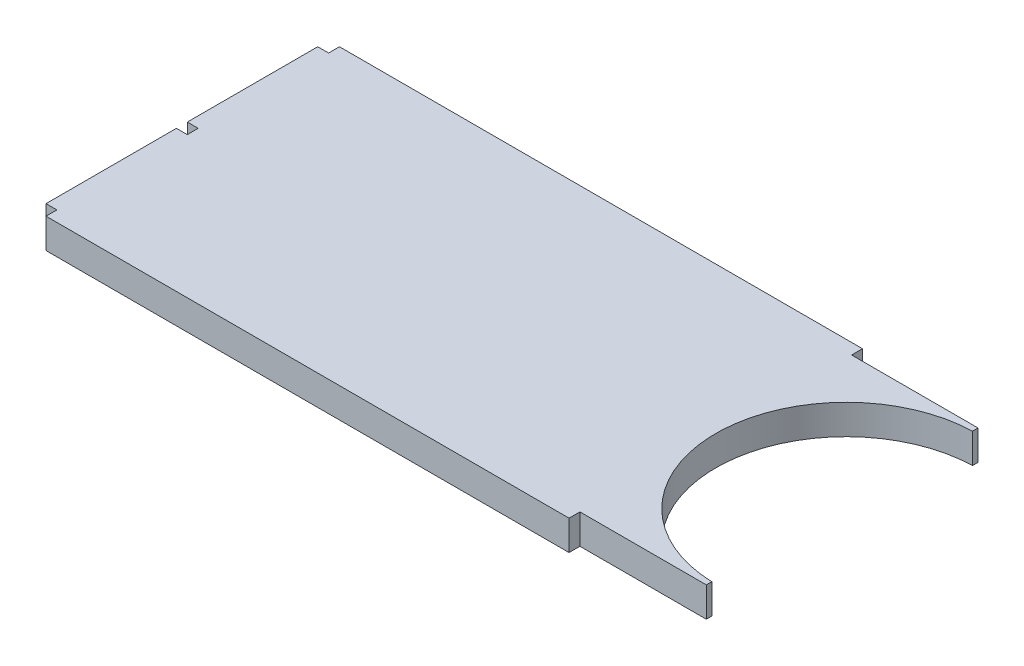
ISO-10303-21;
HEADER;
FILE_DESCRIPTION(('STEP AP214'),'2;1');
FILE_NAME('part.step','',(''),(''),'','','');
FILE_SCHEMA(('AUTOMOTIVE_DESIGN { 1 0 10303 214 1 1 1 1 }'));
ENDSEC;
DATA;
#1=APPLICATION_CONTEXT('core data for automotive mechanical design processes');
#2=APPLICATION_PROTOCOL_DEFINITION('international standard','automotive_design',2000,#1);
#3=PRODUCT_CONTEXT('',#1,'mechanical');
#4=PRODUCT('Part','Part','',(#3));
#5=PRODUCT_RELATED_PRODUCT_CATEGORY('part','',(#4));
#6=PRODUCT_DEFINITION_FORMATION('','',#4);
#7=PRODUCT_DEFINITION_CONTEXT('part definition',#1,'design');
#8=PRODUCT_DEFINITION('design','',#6,#7);
#9=PRODUCT_DEFINITION_SHAPE('','',#8);
#10=(LENGTH_UNIT() NAMED_UNIT(*) SI_UNIT(.MILLI.,.METRE.));
#11=(NAMED_UNIT(*) PLANE_ANGLE_UNIT() SI_UNIT($,.RADIAN.));
#12=(NAMED_UNIT(*) SI_UNIT($,.STERADIAN.) SOLID_ANGLE_UNIT());
#13=UNCERTAINTY_MEASURE_WITH_UNIT(LENGTH_MEASURE(1.E-05),#10,'distance_accuracy_value','');
#14=(GEOMETRIC_REPRESENTATION_CONTEXT(3) GLOBAL_UNCERTAINTY_ASSIGNED_CONTEXT((#13)) GLOBAL_UNIT_ASSIGNED_CONTEXT((#10,
#11,#12)) REPRESENTATION_CONTEXT('',''));
#15=CARTESIAN_POINT('',(0.,0.,0.));
#16=DIRECTION('',(0.,0.,1.));
#17=DIRECTION('',(1.,0.,0.));
#18=AXIS2_PLACEMENT_3D('',#15,#16,#17);
#19=CARTESIAN_POINT('',(60.75,5.4864,27.));
#20=DIRECTION('',(-1.,0.,0.));
#21=DIRECTION('',(0.,0.,1.));
#22=AXIS2_PLACEMENT_3D('',#19,#20,#21);
#23=PLANE('',#22);
#24=DIRECTION('',(0.,0.,-1.));
#25=VECTOR('',#24,1.);
#26=CARTESIAN_POINT('',(60.75,0.,27.));
#27=LINE('',#26,#25);
#28=CARTESIAN_POINT('',(60.75,0.,25.));
#29=VERTEX_POINT('',#28);
#30=CARTESIAN_POINT('',(60.75,0.,23.9884031148386));
#31=VERTEX_POINT('',#30);
#32=EDGE_CURVE('E288',#29,#31,#27,.T.);
#33=ORIENTED_EDGE('',*,*,#32,.T.);
#34=DIRECTION('',(0.,1.,0.));
#35=VECTOR('',#34,1.);
#36=CARTESIAN_POINT('',(60.75,0.,23.9884031148386));
#37=LINE('',#36,#35);
#38=CARTESIAN_POINT('',(60.75,5.4864,23.9884031148386));
#39=VERTEX_POINT('',#38);
#40=EDGE_CURVE('E218',#31,#39,#37,.T.);
#41=ORIENTED_EDGE('',*,*,#40,.T.);
#42=DIRECTION('',(0.,0.,-1.));
#43=VECTOR('',#42,1.);
#44=CARTESIAN_POINT('',(60.75,5.4864,27.));
#45=LINE('',#44,#43);
#46=CARTESIAN_POINT('',(60.75,5.4864,25.));
#47=VERTEX_POINT('',#46);
#48=EDGE_CURVE('E280',#47,#39,#45,.T.);
#49=ORIENTED_EDGE('',*,*,#48,.F.);
#50=DIRECTION('',(0.,1.,0.));
#51=VECTOR('',#50,1.);
#52=CARTESIAN_POINT('',(60.75,0.,25.));
#53=LINE('',#52,#51);
#54=EDGE_CURVE('E205',#29,#47,#53,.T.);
#55=ORIENTED_EDGE('',*,*,#54,.F.);
#56=EDGE_LOOP('',(#33,#41,#49,#55));
#57=FACE_BOUND('',#56,.T.);
#58=ADVANCED_FACE('F33',(#57),#23,.F.);
#59=CARTESIAN_POINT('',(-60.75,5.4864,27.));
#60=DIRECTION('',(1.,0.,0.));
#61=DIRECTION('',(0.,0.,-1.));
#62=AXIS2_PLACEMENT_3D('',#59,#60,#61);
#63=PLANE('',#62);
#64=DIRECTION('',(0.,0.,1.));
#65=VECTOR('',#64,1.);
#66=CARTESIAN_POINT('',(-60.75,5.4864,27.));
#67=LINE('',#66,#65);
#68=CARTESIAN_POINT('',(-60.75,5.4864,0.999999999999999));
#69=VERTEX_POINT('',#68);
#70=CARTESIAN_POINT('',(-60.75,5.4864,25.));
#71=VERTEX_POINT('',#70);
#72=EDGE_CURVE('E283',#69,#71,#67,.T.);
#73=ORIENTED_EDGE('',*,*,#72,.F.);
#74=DIRECTION('',(0.,1.,0.));
#75=VECTOR('',#74,1.);
#76=CARTESIAN_POINT('',(-60.75,0.,0.999999999999999));
#77=LINE('',#76,#75);
#78=CARTESIAN_POINT('',(-60.75,0.,0.999999999999999));
#79=VERTEX_POINT('',#78);
#80=EDGE_CURVE('E197',#79,#69,#77,.T.);
#81=ORIENTED_EDGE('',*,*,#80,.F.);
#82=DIRECTION('',(0.,0.,1.));
#83=VECTOR('',#82,1.);
#84=CARTESIAN_POINT('',(-60.75,0.,27.));
#85=LINE('',#84,#83);
#86=CARTESIAN_POINT('',(-60.75,0.,25.));
#87=VERTEX_POINT('',#86);
#88=EDGE_CURVE('E290',#79,#87,#85,.T.);
#89=ORIENTED_EDGE('',*,*,#88,.T.);
#90=DIRECTION('',(0.,1.,0.));
#91=VECTOR('',#90,1.);
#92=CARTESIAN_POINT('',(-60.75,0.,25.));
#93=LINE('',#92,#91);
#94=EDGE_CURVE('E235',#87,#71,#93,.T.);
#95=ORIENTED_EDGE('',*,*,#94,.T.);
#96=EDGE_LOOP('',(#73,#81,#89,#95));
#97=FACE_BOUND('',#96,.T.);
#98=ADVANCED_FACE('F299',(#97),#63,.F.);
#99=CARTESIAN_POINT('',(60.75,5.4864,-23.9884031148386));
#100=VERTEX_POINT('',#99);
#101=CARTESIAN_POINT('',(60.75,5.4864,-25.));
#102=VERTEX_POINT('',#101);
#103=EDGE_CURVE('E277',#100,#102,#45,.T.);
#104=ORIENTED_EDGE('',*,*,#103,.F.);
#105=DIRECTION('',(0.,1.,0.));
#106=VECTOR('',#105,1.);
#107=CARTESIAN_POINT('',(60.75,0.,-23.9884031148386));
#108=LINE('',#107,#106);
#109=CARTESIAN_POINT('',(60.75,0.,-23.9884031148386));
#110=VERTEX_POINT('',#109);
#111=EDGE_CURVE('E209',#110,#100,#108,.T.);
#112=ORIENTED_EDGE('',*,*,#111,.F.);
#113=CARTESIAN_POINT('',(60.75,0.,-25.));
#114=VERTEX_POINT('',#113);
#115=EDGE_CURVE('E273',#110,#114,#27,.T.);
#116=ORIENTED_EDGE('',*,*,#115,.T.);
#117=DIRECTION('',(0.,1.,0.));
#118=VECTOR('',#117,1.);
#119=CARTESIAN_POINT('',(60.75,0.,-25.));
#120=LINE('',#119,#118);
#121=EDGE_CURVE('E254',#114,#102,#120,.T.);
#122=ORIENTED_EDGE('',*,*,#121,.T.);
#123=EDGE_LOOP('',(#104,#112,#116,#122));
#124=FACE_BOUND('',#123,.T.);
#125=ADVANCED_FACE('F35',(#124),#23,.F.);
#126=CARTESIAN_POINT('',(-60.75,5.4864,-27.));
#127=DIRECTION('',(0.,0.,1.));
#128=DIRECTION('',(1.,0.,0.));
#129=AXIS2_PLACEMENT_3D('',#126,#127,#128);
#130=PLANE('',#129);
#131=DIRECTION('',(-1.,0.,0.));
#132=VECTOR('',#131,1.);
#133=CARTESIAN_POINT('',(-60.75,5.4864,-27.));
#134=LINE('',#133,#132);
#135=CARTESIAN_POINT('',(37.496,5.4864,-27.));
#136=VERTEX_POINT('',#135);
#137=CARTESIAN_POINT('',(-58.75,5.4864,-27.));
#138=VERTEX_POINT('',#137);
#139=EDGE_CURVE('E281',#136,#138,#134,.T.);
#140=ORIENTED_EDGE('',*,*,#139,.F.);
#141=DIRECTION('',(0.,1.,0.));
#142=VECTOR('',#141,1.);
#143=CARTESIAN_POINT('',(37.496,0.,-27.));
#144=LINE('',#143,#142);
#145=CARTESIAN_POINT('',(37.496,0.,-27.));
#146=VERTEX_POINT('',#145);
#147=EDGE_CURVE('E233',#146,#136,#144,.T.);
#148=ORIENTED_EDGE('',*,*,#147,.F.);
#149=DIRECTION('',(-1.,0.,0.));
#150=VECTOR('',#149,1.);
#151=CARTESIAN_POINT('',(-60.75,0.,-27.));
#152=LINE('',#151,#150);
#153=CARTESIAN_POINT('',(-58.75,0.,-27.));
#154=VERTEX_POINT('',#153);
#155=EDGE_CURVE('E289',#146,#154,#152,.T.);
#156=ORIENTED_EDGE('',*,*,#155,.T.);
#157=DIRECTION('',(0.,1.,0.));
#158=VECTOR('',#157,1.);
#159=CARTESIAN_POINT('',(-58.75,0.,-27.));
#160=LINE('',#159,#158);
#161=EDGE_CURVE('E270',#154,#138,#160,.T.);
#162=ORIENTED_EDGE('',*,*,#161,.T.);
#163=EDGE_LOOP('',(#140,#148,#156,#162));
#164=FACE_BOUND('',#163,.T.);
#165=ADVANCED_FACE('F339',(#164),#130,.F.);
#166=CARTESIAN_POINT('',(-60.75,0.,-25.));
#167=VERTEX_POINT('',#166);
#168=CARTESIAN_POINT('',(-60.75,0.,-0.999999999999997));
#169=VERTEX_POINT('',#168);
#170=EDGE_CURVE('E291',#167,#169,#85,.T.);
#171=ORIENTED_EDGE('',*,*,#170,.T.);
#172=DIRECTION('',(0.,1.,0.));
#173=VECTOR('',#172,1.);
#174=CARTESIAN_POINT('',(-60.75,0.,-0.999999999999998));
#175=LINE('',#174,#173);
#176=CARTESIAN_POINT('',(-60.75,5.4864,-0.999999999999998));
#177=VERTEX_POINT('',#176);
#178=EDGE_CURVE('E170',#169,#177,#175,.T.);
#179=ORIENTED_EDGE('',*,*,#178,.T.);
#180=CARTESIAN_POINT('',(-60.75,5.4864,-25.));
#181=VERTEX_POINT('',#180);
#182=EDGE_CURVE('E42',#181,#177,#67,.T.);
#183=ORIENTED_EDGE('',*,*,#182,.F.);
#184=DIRECTION('',(0.,1.,0.));
#185=VECTOR('',#184,1.);
#186=CARTESIAN_POINT('',(-60.75,0.,-25.));
#187=LINE('',#186,#185);
#188=EDGE_CURVE('E265',#167,#181,#187,.T.);
#189=ORIENTED_EDGE('',*,*,#188,.F.);
#190=EDGE_LOOP('',(#171,#179,#183,#189));
#191=FACE_BOUND('',#190,.T.);
#192=ADVANCED_FACE('F336',(#191),#63,.F.);
#193=CARTESIAN_POINT('',(-60.75,5.4864,27.));
#194=DIRECTION('',(0.,0.,-1.));
#195=DIRECTION('',(-1.,0.,0.));
#196=AXIS2_PLACEMENT_3D('',#193,#194,#195);
#197=PLANE('',#196);
#198=DIRECTION('',(1.,0.,0.));
#199=VECTOR('',#198,1.);
#200=CARTESIAN_POINT('',(-60.75,0.,27.));
#201=LINE('',#200,#199);
#202=CARTESIAN_POINT('',(-58.75,0.,27.));
#203=VERTEX_POINT('',#202);
#204=CARTESIAN_POINT('',(37.496,0.,27.));
#205=VERTEX_POINT('',#204);
#206=EDGE_CURVE('E37',#203,#205,#201,.T.);
#207=ORIENTED_EDGE('',*,*,#206,.T.);
#208=DIRECTION('',(0.,1.,0.));
#209=VECTOR('',#208,1.);
#210=CARTESIAN_POINT('',(37.496,0.,27.));
#211=LINE('',#210,#209);
#212=CARTESIAN_POINT('',(37.496,5.4864,27.));
#213=VERTEX_POINT('',#212);
#214=EDGE_CURVE('E192',#205,#213,#211,.T.);
#215=ORIENTED_EDGE('',*,*,#214,.T.);
#216=DIRECTION('',(1.,0.,0.));
#217=VECTOR('',#216,1.);
#218=CARTESIAN_POINT('',(-60.75,5.4864,27.));
#219=LINE('',#218,#217);
#220=CARTESIAN_POINT('',(-58.75,5.4864,27.));
#221=VERTEX_POINT('',#220);
#222=EDGE_CURVE('E11',#221,#213,#219,.T.);
#223=ORIENTED_EDGE('',*,*,#222,.F.);
#224=DIRECTION('',(0.,1.,0.));
#225=VECTOR('',#224,1.);
#226=CARTESIAN_POINT('',(-58.75,0.,27.));
#227=LINE('',#226,#225);
#228=EDGE_CURVE('E229',#203,#221,#227,.T.);
#229=ORIENTED_EDGE('',*,*,#228,.F.);
#230=EDGE_LOOP('',(#207,#215,#223,#229));
#231=FACE_BOUND('',#230,.T.);
#232=ADVANCED_FACE('F308',(#231),#197,.F.);
#233=CARTESIAN_POINT('',(0.,5.4864,0.));
#234=DIRECTION('',(0.,-1.,0.));
#235=DIRECTION('',(0.,0.,-1.));
#236=AXIS2_PLACEMENT_3D('',#233,#234,#235);
#237=PLANE('',#236);
#238=ORIENTED_EDGE('',*,*,#48,.T.);
#239=CARTESIAN_POINT('',(61.496,5.4864,0.));
#240=DIRECTION('',(0.,1.,0.));
#241=DIRECTION('',(0.,0.,-1.));
#242=AXIS2_PLACEMENT_3D('',#239,#240,#241);
#243=CIRCLE('',#242,24.);
#244=EDGE_CURVE('E219',#100,#39,#243,.T.);
#245=ORIENTED_EDGE('',*,*,#244,.F.);
#246=ORIENTED_EDGE('',*,*,#103,.T.);
#247=DIRECTION('',(1.,0.,0.));
#248=VECTOR('',#247,1.);
#249=CARTESIAN_POINT('',(37.496,5.4864,-25.));
#250=LINE('',#249,#248);
#251=CARTESIAN_POINT('',(37.496,5.4864,-25.));
#252=VERTEX_POINT('',#251);
#253=EDGE_CURVE('E246',#252,#102,#250,.T.);
#254=ORIENTED_EDGE('',*,*,#253,.F.);
#255=DIRECTION('',(0.,0.,1.));
#256=VECTOR('',#255,1.);
#257=CARTESIAN_POINT('',(37.496,5.4864,-27.));
#258=LINE('',#257,#256);
#259=EDGE_CURVE('E196',#136,#252,#258,.T.);
#260=ORIENTED_EDGE('',*,*,#259,.F.);
#261=ORIENTED_EDGE('',*,*,#139,.T.);
#262=DIRECTION('',(0.,0.,-1.));
#263=VECTOR('',#262,1.);
#264=CARTESIAN_POINT('',(-58.75,5.4864,-27.));
#265=LINE('',#264,#263);
#266=CARTESIAN_POINT('',(-58.75,5.4864,-25.));
#267=VERTEX_POINT('',#266);
#268=EDGE_CURVE('E262',#267,#138,#265,.T.);
#269=ORIENTED_EDGE('',*,*,#268,.F.);
#270=DIRECTION('',(1.,0.,0.));
#271=VECTOR('',#270,1.);
#272=CARTESIAN_POINT('',(-60.75,5.4864,-25.));
#273=LINE('',#272,#271);
#274=EDGE_CURVE('E238',#181,#267,#273,.T.);
#275=ORIENTED_EDGE('',*,*,#274,.F.);
#276=ORIENTED_EDGE('',*,*,#182,.T.);
#277=DIRECTION('',(-1.,0.,0.));
#278=VECTOR('',#277,1.);
#279=CARTESIAN_POINT('',(-58.75,5.4864,-0.999999999999999));
#280=LINE('',#279,#278);
#281=CARTESIAN_POINT('',(-58.75,5.4864,-0.999999999999999));
#282=VERTEX_POINT('',#281);
#283=EDGE_CURVE('E187',#282,#177,#280,.T.);
#284=ORIENTED_EDGE('',*,*,#283,.F.);
#285=DIRECTION('',(0.,0.,-1.));
#286=VECTOR('',#285,1.);
#287=CARTESIAN_POINT('',(-58.75,5.4864,0.999999999999999));
#288=LINE('',#287,#286);
#289=CARTESIAN_POINT('',(-58.75,5.4864,0.999999999999999));
#290=VERTEX_POINT('',#289);
#291=EDGE_CURVE('E167',#290,#282,#288,.T.);
#292=ORIENTED_EDGE('',*,*,#291,.F.);
#293=DIRECTION('',(1.,0.,0.));
#294=VECTOR('',#293,1.);
#295=CARTESIAN_POINT('',(-58.75,5.4864,0.999999999999999));
#296=LINE('',#295,#294);
#297=EDGE_CURVE('E184',#69,#290,#296,.T.);
#298=ORIENTED_EDGE('',*,*,#297,.F.);
#299=ORIENTED_EDGE('',*,*,#72,.T.);
#300=DIRECTION('',(-1.,0.,0.));
#301=VECTOR('',#300,1.);
#302=CARTESIAN_POINT('',(-60.75,5.4864,25.));
#303=LINE('',#302,#301);
#304=CARTESIAN_POINT('',(-58.75,5.4864,25.));
#305=VERTEX_POINT('',#304);
#306=EDGE_CURVE('E227',#305,#71,#303,.T.);
#307=ORIENTED_EDGE('',*,*,#306,.F.);
#308=DIRECTION('',(0.,0.,-1.));
#309=VECTOR('',#308,1.);
#310=CARTESIAN_POINT('',(-58.75,5.4864,27.));
#311=LINE('',#310,#309);
#312=EDGE_CURVE('E230',#221,#305,#311,.T.);
#313=ORIENTED_EDGE('',*,*,#312,.F.);
#314=ORIENTED_EDGE('',*,*,#222,.T.);
#315=DIRECTION('',(0.,0.,1.));
#316=VECTOR('',#315,1.);
#317=CARTESIAN_POINT('',(37.496,5.4864,25.));
#318=LINE('',#317,#316);
#319=CARTESIAN_POINT('',(37.496,5.4864,25.));
#320=VERTEX_POINT('',#319);
#321=EDGE_CURVE('E203',#320,#213,#318,.T.);
#322=ORIENTED_EDGE('',*,*,#321,.F.);
#323=DIRECTION('',(-1.,0.,0.));
#324=VECTOR('',#323,1.);
#325=CARTESIAN_POINT('',(60.75,5.4864,25.));
#326=LINE('',#325,#324);
#327=EDGE_CURVE('E206',#47,#320,#326,.T.);
#328=ORIENTED_EDGE('',*,*,#327,.F.);
#329=EDGE_LOOP('',(#238,#245,#246,#254,#260,#261,#269,#275,#276,#284,#292,#298,#299,#307,#313,
#314,#322,#328));
#330=FACE_BOUND('',#329,.T.);
#331=ADVANCED_FACE('F312',(#330),#237,.F.);
#332=CARTESIAN_POINT('',(0.,0.,0.));
#333=DIRECTION('',(0.,-1.,0.));
#334=DIRECTION('',(0.,0.,-1.));
#335=AXIS2_PLACEMENT_3D('',#332,#333,#334);
#336=PLANE('',#335);
#337=CARTESIAN_POINT('',(61.496,0.,0.));
#338=DIRECTION('',(0.,1.,0.));
#339=DIRECTION('',(0.,0.,-1.));
#340=AXIS2_PLACEMENT_3D('',#337,#338,#339);
#341=CIRCLE('',#340,24.);
#342=EDGE_CURVE('E216',#110,#31,#341,.T.);
#343=ORIENTED_EDGE('',*,*,#342,.T.);
#344=ORIENTED_EDGE('',*,*,#32,.F.);
#345=DIRECTION('',(-1.,0.,0.));
#346=VECTOR('',#345,1.);
#347=CARTESIAN_POINT('',(60.75,0.,25.));
#348=LINE('',#347,#346);
#349=CARTESIAN_POINT('',(37.496,0.,25.));
#350=VERTEX_POINT('',#349);
#351=EDGE_CURVE('E200',#29,#350,#348,.T.);
#352=ORIENTED_EDGE('',*,*,#351,.T.);
#353=DIRECTION('',(0.,0.,1.));
#354=VECTOR('',#353,1.);
#355=CARTESIAN_POINT('',(37.496,0.,25.));
#356=LINE('',#355,#354);
#357=EDGE_CURVE('E50',#350,#205,#356,.T.);
#358=ORIENTED_EDGE('',*,*,#357,.T.);
#359=ORIENTED_EDGE('',*,*,#206,.F.);
#360=DIRECTION('',(0.,0.,-1.));
#361=VECTOR('',#360,1.);
#362=CARTESIAN_POINT('',(-58.75,0.,27.));
#363=LINE('',#362,#361);
#364=CARTESIAN_POINT('',(-58.75,0.,25.));
#365=VERTEX_POINT('',#364);
#366=EDGE_CURVE('E224',#203,#365,#363,.T.);
#367=ORIENTED_EDGE('',*,*,#366,.T.);
#368=DIRECTION('',(-1.,0.,0.));
#369=VECTOR('',#368,1.);
#370=CARTESIAN_POINT('',(-60.75,0.,25.));
#371=LINE('',#370,#369);
#372=EDGE_CURVE('E58',#365,#87,#371,.T.);
#373=ORIENTED_EDGE('',*,*,#372,.T.);
#374=ORIENTED_EDGE('',*,*,#88,.F.);
#375=DIRECTION('',(1.,0.,0.));
#376=VECTOR('',#375,1.);
#377=CARTESIAN_POINT('',(-58.75,0.,0.999999999999999));
#378=LINE('',#377,#376);
#379=CARTESIAN_POINT('',(-58.75,0.,0.999999999999999));
#380=VERTEX_POINT('',#379);
#381=EDGE_CURVE('E171',#79,#380,#378,.T.);
#382=ORIENTED_EDGE('',*,*,#381,.T.);
#383=DIRECTION('',(0.,0.,-1.));
#384=VECTOR('',#383,1.);
#385=CARTESIAN_POINT('',(-58.75,0.,0.999999999999999));
#386=LINE('',#385,#384);
#387=CARTESIAN_POINT('',(-58.75,0.,-0.999999999999999));
#388=VERTEX_POINT('',#387);
#389=EDGE_CURVE('E164',#380,#388,#386,.T.);
#390=ORIENTED_EDGE('',*,*,#389,.T.);
#391=DIRECTION('',(-1.,0.,0.));
#392=VECTOR('',#391,1.);
#393=CARTESIAN_POINT('',(-58.75,0.,-0.999999999999999));
#394=LINE('',#393,#392);
#395=EDGE_CURVE('E174',#388,#169,#394,.T.);
#396=ORIENTED_EDGE('',*,*,#395,.T.);
#397=ORIENTED_EDGE('',*,*,#170,.F.);
#398=DIRECTION('',(1.,0.,0.));
#399=VECTOR('',#398,1.);
#400=CARTESIAN_POINT('',(-60.75,0.,-25.));
#401=LINE('',#400,#399);
#402=CARTESIAN_POINT('',(-58.75,0.,-25.));
#403=VERTEX_POINT('',#402);
#404=EDGE_CURVE('E258',#167,#403,#401,.T.);
#405=ORIENTED_EDGE('',*,*,#404,.T.);
#406=DIRECTION('',(0.,0.,-1.));
#407=VECTOR('',#406,1.);
#408=CARTESIAN_POINT('',(-58.75,0.,-27.));
#409=LINE('',#408,#407);
#410=EDGE_CURVE('E261',#403,#154,#409,.T.);
#411=ORIENTED_EDGE('',*,*,#410,.T.);
#412=ORIENTED_EDGE('',*,*,#155,.F.);
#413=DIRECTION('',(0.,0.,1.));
#414=VECTOR('',#413,1.);
#415=CARTESIAN_POINT('',(37.496,0.,-27.));
#416=LINE('',#415,#414);
#417=CARTESIAN_POINT('',(37.496,0.,-25.));
#418=VERTEX_POINT('',#417);
#419=EDGE_CURVE('E242',#146,#418,#416,.T.);
#420=ORIENTED_EDGE('',*,*,#419,.T.);
#421=DIRECTION('',(1.,0.,0.));
#422=VECTOR('',#421,1.);
#423=CARTESIAN_POINT('',(37.496,0.,-25.));
#424=LINE('',#423,#422);
#425=EDGE_CURVE('E245',#418,#114,#424,.T.);
#426=ORIENTED_EDGE('',*,*,#425,.T.);
#427=ORIENTED_EDGE('',*,*,#115,.F.);
#428=EDGE_LOOP('',(#343,#344,#352,#358,#359,#367,#373,#374,#382,#390,#396,#397,#405,#411,#412,
#420,#426,#427));
#429=FACE_BOUND('',#428,.T.);
#430=ADVANCED_FACE('F182',(#429),#336,.T.);
#431=CARTESIAN_POINT('',(-58.75,0.,-27.));
#432=DIRECTION('',(1.,0.,0.));
#433=DIRECTION('',(0.,0.,-1.));
#434=AXIS2_PLACEMENT_3D('',#431,#432,#433);
#435=PLANE('',#434);
#436=ORIENTED_EDGE('',*,*,#268,.T.);
#437=ORIENTED_EDGE('',*,*,#161,.F.);
#438=ORIENTED_EDGE('',*,*,#410,.F.);
#439=DIRECTION('',(0.,1.,0.));
#440=VECTOR('',#439,1.);
#441=CARTESIAN_POINT('',(-58.75,0.,-25.));
#442=LINE('',#441,#440);
#443=EDGE_CURVE('E274',#403,#267,#442,.T.);
#444=ORIENTED_EDGE('',*,*,#443,.T.);
#445=EDGE_LOOP('',(#436,#437,#438,#444));
#446=FACE_BOUND('',#445,.T.);
#447=ADVANCED_FACE('F326',(#446),#435,.F.);
#448=CARTESIAN_POINT('',(-60.75,0.,-25.));
#449=DIRECTION('',(0.,0.,1.));
#450=DIRECTION('',(1.,0.,0.));
#451=AXIS2_PLACEMENT_3D('',#448,#449,#450);
#452=PLANE('',#451);
#453=ORIENTED_EDGE('',*,*,#274,.T.);
#454=ORIENTED_EDGE('',*,*,#443,.F.);
#455=ORIENTED_EDGE('',*,*,#404,.F.);
#456=ORIENTED_EDGE('',*,*,#188,.T.);
#457=EDGE_LOOP('',(#453,#454,#455,#456));
#458=FACE_BOUND('',#457,.T.);
#459=ADVANCED_FACE('F318',(#458),#452,.F.);
#460=CARTESIAN_POINT('',(-60.75,0.,25.));
#461=DIRECTION('',(0.,0.,-1.));
#462=DIRECTION('',(-1.,0.,0.));
#463=AXIS2_PLACEMENT_3D('',#460,#461,#462);
#464=PLANE('',#463);
#465=ORIENTED_EDGE('',*,*,#306,.T.);
#466=ORIENTED_EDGE('',*,*,#94,.F.);
#467=ORIENTED_EDGE('',*,*,#372,.F.);
#468=DIRECTION('',(0.,1.,0.));
#469=VECTOR('',#468,1.);
#470=CARTESIAN_POINT('',(-58.75,0.,25.));
#471=LINE('',#470,#469);
#472=EDGE_CURVE('E239',#365,#305,#471,.T.);
#473=ORIENTED_EDGE('',*,*,#472,.T.);
#474=EDGE_LOOP('',(#465,#466,#467,#473));
#475=FACE_BOUND('',#474,.T.);
#476=ADVANCED_FACE('F316',(#475),#464,.F.);
#477=CARTESIAN_POINT('',(-58.75,0.,27.));
#478=DIRECTION('',(1.,0.,0.));
#479=DIRECTION('',(0.,0.,-1.));
#480=AXIS2_PLACEMENT_3D('',#477,#478,#479);
#481=PLANE('',#480);
#482=ORIENTED_EDGE('',*,*,#312,.T.);
#483=ORIENTED_EDGE('',*,*,#472,.F.);
#484=ORIENTED_EDGE('',*,*,#366,.F.);
#485=ORIENTED_EDGE('',*,*,#228,.T.);
#486=EDGE_LOOP('',(#482,#483,#484,#485));
#487=FACE_BOUND('',#486,.T.);
#488=ADVANCED_FACE('F304',(#487),#481,.F.);
#489=CARTESIAN_POINT('',(37.496,0.,-27.));
#490=DIRECTION('',(-1.,0.,0.));
#491=DIRECTION('',(0.,0.,1.));
#492=AXIS2_PLACEMENT_3D('',#489,#490,#491);
#493=PLANE('',#492);
#494=ORIENTED_EDGE('',*,*,#259,.T.);
#495=DIRECTION('',(0.,1.,0.));
#496=VECTOR('',#495,1.);
#497=CARTESIAN_POINT('',(37.496,0.,-25.));
#498=LINE('',#497,#496);
#499=EDGE_CURVE('E249',#418,#252,#498,.T.);
#500=ORIENTED_EDGE('',*,*,#499,.F.);
#501=ORIENTED_EDGE('',*,*,#419,.F.);
#502=ORIENTED_EDGE('',*,*,#147,.T.);
#503=EDGE_LOOP('',(#494,#500,#501,#502));
#504=FACE_BOUND('',#503,.T.);
#505=ADVANCED_FACE('F324',(#504),#493,.F.);
#506=CARTESIAN_POINT('',(37.496,0.,-25.));
#507=DIRECTION('',(0.,0.,1.));
#508=DIRECTION('',(1.,0.,0.));
#509=AXIS2_PLACEMENT_3D('',#506,#507,#508);
#510=PLANE('',#509);
#511=ORIENTED_EDGE('',*,*,#253,.T.);
#512=ORIENTED_EDGE('',*,*,#121,.F.);
#513=ORIENTED_EDGE('',*,*,#425,.F.);
#514=ORIENTED_EDGE('',*,*,#499,.T.);
#515=EDGE_LOOP('',(#511,#512,#513,#514));
#516=FACE_BOUND('',#515,.T.);
#517=ADVANCED_FACE('F359',(#516),#510,.F.);
#518=CARTESIAN_POINT('',(-58.75,0.,0.999999999999999));
#519=DIRECTION('',(1.,0.,0.));
#520=DIRECTION('',(0.,0.,-1.));
#521=AXIS2_PLACEMENT_3D('',#518,#519,#520);
#522=PLANE('',#521);
#523=ORIENTED_EDGE('',*,*,#291,.T.);
#524=DIRECTION('',(0.,1.,0.));
#525=VECTOR('',#524,1.);
#526=CARTESIAN_POINT('',(-58.75,0.,-0.999999999999999));
#527=LINE('',#526,#525);
#528=EDGE_CURVE('E160',#388,#282,#527,.T.);
#529=ORIENTED_EDGE('',*,*,#528,.F.);
#530=ORIENTED_EDGE('',*,*,#389,.F.);
#531=DIRECTION('',(0.,1.,0.));
#532=VECTOR('',#531,1.);
#533=CARTESIAN_POINT('',(-58.75,0.,0.999999999999999));
#534=LINE('',#533,#532);
#535=EDGE_CURVE('E194',#380,#290,#534,.T.);
#536=ORIENTED_EDGE('',*,*,#535,.T.);
#537=EDGE_LOOP('',(#523,#529,#530,#536));
#538=FACE_BOUND('',#537,.T.);
#539=ADVANCED_FACE('F162',(#538),#522,.F.);
#540=CARTESIAN_POINT('',(-58.75,0.,0.999999999999999));
#541=DIRECTION('',(0.,0.,1.));
#542=DIRECTION('',(1.,0.,0.));
#543=AXIS2_PLACEMENT_3D('',#540,#541,#542);
#544=PLANE('',#543);
#545=ORIENTED_EDGE('',*,*,#297,.T.);
#546=ORIENTED_EDGE('',*,*,#535,.F.);
#547=ORIENTED_EDGE('',*,*,#381,.F.);
#548=ORIENTED_EDGE('',*,*,#80,.T.);
#549=EDGE_LOOP('',(#545,#546,#547,#548));
#550=FACE_BOUND('',#549,.T.);
#551=ADVANCED_FACE('F370',(#550),#544,.F.);
#552=CARTESIAN_POINT('',(-58.75,0.,-0.999999999999999));
#553=DIRECTION('',(0.,0.,-1.));
#554=DIRECTION('',(-1.,0.,0.));
#555=AXIS2_PLACEMENT_3D('',#552,#553,#554);
#556=PLANE('',#555);
#557=ORIENTED_EDGE('',*,*,#283,.T.);
#558=ORIENTED_EDGE('',*,*,#178,.F.);
#559=ORIENTED_EDGE('',*,*,#395,.F.);
#560=ORIENTED_EDGE('',*,*,#528,.T.);
#561=EDGE_LOOP('',(#557,#558,#559,#560));
#562=FACE_BOUND('',#561,.T.);
#563=ADVANCED_FACE('F175',(#562),#556,.F.);
#564=CARTESIAN_POINT('',(37.496,0.,25.));
#565=DIRECTION('',(-1.,0.,0.));
#566=DIRECTION('',(0.,0.,1.));
#567=AXIS2_PLACEMENT_3D('',#564,#565,#566);
#568=PLANE('',#567);
#569=ORIENTED_EDGE('',*,*,#321,.T.);
#570=ORIENTED_EDGE('',*,*,#214,.F.);
#571=ORIENTED_EDGE('',*,*,#357,.F.);
#572=DIRECTION('',(0.,1.,0.));
#573=VECTOR('',#572,1.);
#574=CARTESIAN_POINT('',(37.496,0.,25.));
#575=LINE('',#574,#573);
#576=EDGE_CURVE('E213',#350,#320,#575,.T.);
#577=ORIENTED_EDGE('',*,*,#576,.T.);
#578=EDGE_LOOP('',(#569,#570,#571,#577));
#579=FACE_BOUND('',#578,.T.);
#580=ADVANCED_FACE('F377',(#579),#568,.F.);
#581=CARTESIAN_POINT('',(60.75,0.,25.));
#582=DIRECTION('',(0.,0.,-1.));
#583=DIRECTION('',(-1.,0.,0.));
#584=AXIS2_PLACEMENT_3D('',#581,#582,#583);
#585=PLANE('',#584);
#586=ORIENTED_EDGE('',*,*,#327,.T.);
#587=ORIENTED_EDGE('',*,*,#576,.F.);
#588=ORIENTED_EDGE('',*,*,#351,.F.);
#589=ORIENTED_EDGE('',*,*,#54,.T.);
#590=EDGE_LOOP('',(#586,#587,#588,#589));
#591=FACE_BOUND('',#590,.T.);
#592=ADVANCED_FACE('F383',(#591),#585,.F.);
#593=CARTESIAN_POINT('',(61.496,0.,0.));
#594=DIRECTION('',(0.,1.,0.));
#595=DIRECTION('',(0.,0.,1.));
#596=AXIS2_PLACEMENT_3D('',#593,#594,#595);
#597=CYLINDRICAL_SURFACE('',#596,24.);
#598=ORIENTED_EDGE('',*,*,#244,.T.);
#599=ORIENTED_EDGE('',*,*,#40,.F.);
#600=ORIENTED_EDGE('',*,*,#342,.F.);
#601=ORIENTED_EDGE('',*,*,#111,.T.);
#602=EDGE_LOOP('',(#598,#599,#600,#601));
#603=FACE_BOUND('',#602,.T.);
#604=ADVANCED_FACE('F353',(#603),#597,.F.);
#605=CLOSED_SHELL('',(#58,#98,#125,#165,#192,#232,#331,#430,#447,#459,#476,#488,#505,#517,#539,
#551,#563,#580,#592,#604));
#606=MANIFOLD_SOLID_BREP('B2',#605);
#607=ADVANCED_BREP_SHAPE_REPRESENTATION('',(#18,#606),#14);
#608=SHAPE_DEFINITION_REPRESENTATION(#9,#607);
ENDSEC;
END-ISO-10303-21;
